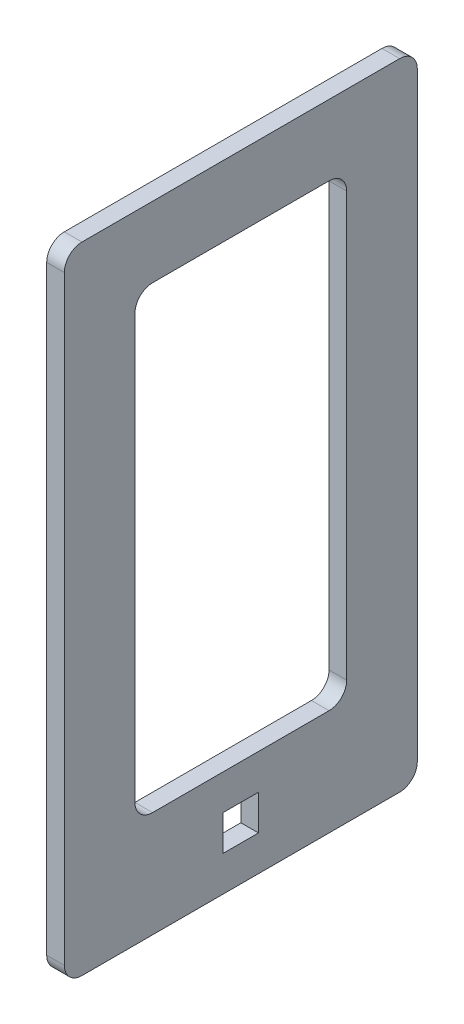
ISO-10303-21;
HEADER;
FILE_DESCRIPTION(('STEP AP214'),'2;1');
FILE_NAME('part.step','',(''),(''),'','','');
FILE_SCHEMA(('AUTOMOTIVE_DESIGN { 1 0 10303 214 1 1 1 1 }'));
ENDSEC;
DATA;
#1=APPLICATION_CONTEXT('core data for automotive mechanical design processes');
#2=APPLICATION_PROTOCOL_DEFINITION('international standard','automotive_design',2000,#1);
#3=PRODUCT_CONTEXT('',#1,'mechanical');
#4=PRODUCT('Part','Part','',(#3));
#5=PRODUCT_RELATED_PRODUCT_CATEGORY('part','',(#4));
#6=PRODUCT_DEFINITION_FORMATION('','',#4);
#7=PRODUCT_DEFINITION_CONTEXT('part definition',#1,'design');
#8=PRODUCT_DEFINITION('design','',#6,#7);
#9=PRODUCT_DEFINITION_SHAPE('','',#8);
#10=(LENGTH_UNIT() NAMED_UNIT(*) SI_UNIT(.MILLI.,.METRE.));
#11=(NAMED_UNIT(*) PLANE_ANGLE_UNIT() SI_UNIT($,.RADIAN.));
#12=(NAMED_UNIT(*) SI_UNIT($,.STERADIAN.) SOLID_ANGLE_UNIT());
#13=UNCERTAINTY_MEASURE_WITH_UNIT(LENGTH_MEASURE(1.E-05),#10,'distance_accuracy_value','');
#14=(GEOMETRIC_REPRESENTATION_CONTEXT(3) GLOBAL_UNCERTAINTY_ASSIGNED_CONTEXT((#13)) GLOBAL_UNIT_ASSIGNED_CONTEXT((#10,
#11,#12)) REPRESENTATION_CONTEXT('',''));
#15=CARTESIAN_POINT('',(0.,0.,0.));
#16=DIRECTION('',(0.,0.,1.));
#17=DIRECTION('',(1.,0.,0.));
#18=AXIS2_PLACEMENT_3D('',#15,#16,#17);
#19=CARTESIAN_POINT('',(6.35,-107.95,57.15));
#20=DIRECTION('',(-1.,0.,0.));
#21=DIRECTION('',(0.,0.,1.));
#22=AXIS2_PLACEMENT_3D('',#19,#20,#21);
#23=PLANE('',#22);
#24=DIRECTION('',(0.,0.,1.));
#25=VECTOR('',#24,1.);
#26=CARTESIAN_POINT('',(6.35,-88.9,6.35000000000005));
#27=LINE('',#26,#25);
#28=CARTESIAN_POINT('',(6.35,-88.9,-6.34999999999995));
#29=VERTEX_POINT('',#28);
#30=CARTESIAN_POINT('',(6.35,-88.9,6.35000000000005));
#31=VERTEX_POINT('',#30);
#32=EDGE_CURVE('E201',#29,#31,#27,.T.);
#33=ORIENTED_EDGE('',*,*,#32,.F.);
#34=DIRECTION('',(0.,1.,0.));
#35=VECTOR('',#34,1.);
#36=CARTESIAN_POINT('',(6.35,-101.6,-6.34999999999995));
#37=LINE('',#36,#35);
#38=CARTESIAN_POINT('',(6.35,-101.6,-6.34999999999995));
#39=VERTEX_POINT('',#38);
#40=EDGE_CURVE('E55',#39,#29,#37,.T.);
#41=ORIENTED_EDGE('',*,*,#40,.F.);
#42=DIRECTION('',(0.,0.,-1.));
#43=VECTOR('',#42,1.);
#44=CARTESIAN_POINT('',(6.35,-101.6,6.35000000000005));
#45=LINE('',#44,#43);
#46=CARTESIAN_POINT('',(6.35,-101.6,6.35000000000005));
#47=VERTEX_POINT('',#46);
#48=EDGE_CURVE('E191',#47,#39,#45,.T.);
#49=ORIENTED_EDGE('',*,*,#48,.F.);
#50=DIRECTION('',(0.,-1.,0.));
#51=VECTOR('',#50,1.);
#52=CARTESIAN_POINT('',(6.35,-101.6,6.35000000000005));
#53=LINE('',#52,#51);
#54=EDGE_CURVE('E209',#31,#47,#53,.T.);
#55=ORIENTED_EDGE('',*,*,#54,.F.);
#56=EDGE_LOOP('',(#33,#41,#49,#55));
#57=FACE_BOUND('',#56,.T.);
#58=CARTESIAN_POINT('',(6.35,-107.95,57.15));
#59=DIRECTION('',(1.,0.,0.));
#60=DIRECTION('',(0.,0.,1.));
#61=AXIS2_PLACEMENT_3D('',#58,#59,#60);
#62=CIRCLE('',#61,6.35);
#63=CARTESIAN_POINT('',(6.35,-107.95,63.5));
#64=VERTEX_POINT('',#63);
#65=CARTESIAN_POINT('',(6.35,-114.3,57.15));
#66=VERTEX_POINT('',#65);
#67=EDGE_CURVE('E306',#64,#66,#62,.T.);
#68=ORIENTED_EDGE('',*,*,#67,.T.);
#69=DIRECTION('',(0.,0.,-1.));
#70=VECTOR('',#69,1.);
#71=CARTESIAN_POINT('',(6.35,-114.3,57.15));
#72=LINE('',#71,#70);
#73=CARTESIAN_POINT('',(6.35,-114.3,-57.15));
#74=VERTEX_POINT('',#73);
#75=EDGE_CURVE('E310',#66,#74,#72,.T.);
#76=ORIENTED_EDGE('',*,*,#75,.T.);
#77=CARTESIAN_POINT('',(6.35,-107.95,-57.15));
#78=DIRECTION('',(1.,0.,0.));
#79=DIRECTION('',(0.,0.,1.));
#80=AXIS2_PLACEMENT_3D('',#77,#78,#79);
#81=CIRCLE('',#80,6.35);
#82=CARTESIAN_POINT('',(6.35,-107.95,-63.5));
#83=VERTEX_POINT('',#82);
#84=EDGE_CURVE('E314',#74,#83,#81,.T.);
#85=ORIENTED_EDGE('',*,*,#84,.T.);
#86=DIRECTION('',(0.,1.,0.));
#87=VECTOR('',#86,1.);
#88=CARTESIAN_POINT('',(6.35,-107.95,-63.5));
#89=LINE('',#88,#87);
#90=CARTESIAN_POINT('',(6.35,107.95,-63.5));
#91=VERTEX_POINT('',#90);
#92=EDGE_CURVE('E317',#83,#91,#89,.T.);
#93=ORIENTED_EDGE('',*,*,#92,.T.);
#94=CARTESIAN_POINT('',(6.35,107.95,-57.15));
#95=DIRECTION('',(1.,0.,0.));
#96=DIRECTION('',(0.,0.,-1.));
#97=AXIS2_PLACEMENT_3D('',#94,#95,#96);
#98=CIRCLE('',#97,6.35);
#99=CARTESIAN_POINT('',(6.35,114.3,-57.15));
#100=VERTEX_POINT('',#99);
#101=EDGE_CURVE('E320',#91,#100,#98,.T.);
#102=ORIENTED_EDGE('',*,*,#101,.T.);
#103=DIRECTION('',(0.,0.,1.));
#104=VECTOR('',#103,1.);
#105=CARTESIAN_POINT('',(6.35,114.3,57.15));
#106=LINE('',#105,#104);
#107=CARTESIAN_POINT('',(6.35,114.3,57.15));
#108=VERTEX_POINT('',#107);
#109=EDGE_CURVE('E323',#100,#108,#106,.T.);
#110=ORIENTED_EDGE('',*,*,#109,.T.);
#111=CARTESIAN_POINT('',(6.35,107.95,57.15));
#112=DIRECTION('',(1.,0.,0.));
#113=DIRECTION('',(0.,0.,1.));
#114=AXIS2_PLACEMENT_3D('',#111,#112,#113);
#115=CIRCLE('',#114,6.35);
#116=CARTESIAN_POINT('',(6.35,107.95,63.5));
#117=VERTEX_POINT('',#116);
#118=EDGE_CURVE('E326',#108,#117,#115,.T.);
#119=ORIENTED_EDGE('',*,*,#118,.T.);
#120=DIRECTION('',(0.,-1.,0.));
#121=VECTOR('',#120,1.);
#122=CARTESIAN_POINT('',(6.35,-107.95,63.5));
#123=LINE('',#122,#121);
#124=EDGE_CURVE('E329',#117,#64,#123,.T.);
#125=ORIENTED_EDGE('',*,*,#124,.T.);
#126=EDGE_LOOP('',(#68,#76,#85,#93,#102,#110,#119,#125));
#127=FACE_BOUND('',#126,.T.);
#128=CARTESIAN_POINT('',(6.35,-69.85,-31.75));
#129=DIRECTION('',(1.,0.,0.));
#130=DIRECTION('',(0.,0.,-1.));
#131=AXIS2_PLACEMENT_3D('',#128,#129,#130);
#132=CIRCLE('',#131,6.34999999999999);
#133=CARTESIAN_POINT('',(6.35,-76.2,-31.75));
#134=VERTEX_POINT('',#133);
#135=CARTESIAN_POINT('',(6.35,-69.85,-38.1));
#136=VERTEX_POINT('',#135);
#137=EDGE_CURVE('E223',#134,#136,#132,.T.);
#138=ORIENTED_EDGE('',*,*,#137,.F.);
#139=DIRECTION('',(0.,0.,-1.));
#140=VECTOR('',#139,1.);
#141=CARTESIAN_POINT('',(6.35,-76.2,31.75));
#142=LINE('',#141,#140);
#143=CARTESIAN_POINT('',(6.35,-76.2,31.75));
#144=VERTEX_POINT('',#143);
#145=EDGE_CURVE('E246',#144,#134,#142,.T.);
#146=ORIENTED_EDGE('',*,*,#145,.F.);
#147=CARTESIAN_POINT('',(6.35,-69.85,31.75));
#148=DIRECTION('',(1.,0.,0.));
#149=DIRECTION('',(0.,0.,1.));
#150=AXIS2_PLACEMENT_3D('',#147,#148,#149);
#151=CIRCLE('',#150,6.35);
#152=CARTESIAN_POINT('',(6.35,-69.85,38.1));
#153=VERTEX_POINT('',#152);
#154=EDGE_CURVE('E242',#153,#144,#151,.T.);
#155=ORIENTED_EDGE('',*,*,#154,.F.);
#156=DIRECTION('',(0.,-1.,0.));
#157=VECTOR('',#156,1.);
#158=CARTESIAN_POINT('',(6.35,-69.85,38.1));
#159=LINE('',#158,#157);
#160=CARTESIAN_POINT('',(6.35,82.55,38.1));
#161=VERTEX_POINT('',#160);
#162=EDGE_CURVE('E239',#161,#153,#159,.T.);
#163=ORIENTED_EDGE('',*,*,#162,.F.);
#164=CARTESIAN_POINT('',(6.35,82.55,31.75));
#165=DIRECTION('',(1.,0.,0.));
#166=DIRECTION('',(0.,0.,1.));
#167=AXIS2_PLACEMENT_3D('',#164,#165,#166);
#168=CIRCLE('',#167,6.35);
#169=CARTESIAN_POINT('',(6.35,88.9,31.75));
#170=VERTEX_POINT('',#169);
#171=EDGE_CURVE('E236',#170,#161,#168,.T.);
#172=ORIENTED_EDGE('',*,*,#171,.F.);
#173=DIRECTION('',(0.,0.,1.));
#174=VECTOR('',#173,1.);
#175=CARTESIAN_POINT('',(6.35,88.9,31.75));
#176=LINE('',#175,#174);
#177=CARTESIAN_POINT('',(6.35,88.9,-31.75));
#178=VERTEX_POINT('',#177);
#179=EDGE_CURVE('E233',#178,#170,#176,.T.);
#180=ORIENTED_EDGE('',*,*,#179,.F.);
#181=CARTESIAN_POINT('',(6.35,82.55,-31.75));
#182=DIRECTION('',(1.,0.,0.));
#183=DIRECTION('',(0.,0.,1.));
#184=AXIS2_PLACEMENT_3D('',#181,#182,#183);
#185=CIRCLE('',#184,6.35000000000001);
#186=CARTESIAN_POINT('',(6.35,82.55,-38.1));
#187=VERTEX_POINT('',#186);
#188=EDGE_CURVE('E230',#187,#178,#185,.T.);
#189=ORIENTED_EDGE('',*,*,#188,.F.);
#190=DIRECTION('',(0.,1.,0.));
#191=VECTOR('',#190,1.);
#192=CARTESIAN_POINT('',(6.35,-69.85,-38.1));
#193=LINE('',#192,#191);
#194=EDGE_CURVE('E226',#136,#187,#193,.T.);
#195=ORIENTED_EDGE('',*,*,#194,.F.);
#196=EDGE_LOOP('',(#138,#146,#155,#163,#172,#180,#189,#195));
#197=FACE_BOUND('',#196,.T.);
#198=ADVANCED_FACE('F39',(#57,#127,#197),#23,.F.);
#199=CARTESIAN_POINT('',(0.,-107.95,57.15));
#200=DIRECTION('',(-1.,0.,0.));
#201=DIRECTION('',(0.,0.,1.));
#202=AXIS2_PLACEMENT_3D('',#199,#200,#201);
#203=PLANE('',#202);
#204=DIRECTION('',(0.,1.,0.));
#205=VECTOR('',#204,1.);
#206=CARTESIAN_POINT('',(0.,-101.6,-6.34999999999995));
#207=LINE('',#206,#205);
#208=CARTESIAN_POINT('',(0.,-101.6,-6.34999999999995));
#209=VERTEX_POINT('',#208);
#210=CARTESIAN_POINT('',(0.,-88.9,-6.34999999999995));
#211=VERTEX_POINT('',#210);
#212=EDGE_CURVE('E188',#209,#211,#207,.T.);
#213=ORIENTED_EDGE('',*,*,#212,.T.);
#214=DIRECTION('',(0.,0.,1.));
#215=VECTOR('',#214,1.);
#216=CARTESIAN_POINT('',(0.,-88.9,6.35000000000005));
#217=LINE('',#216,#215);
#218=CARTESIAN_POINT('',(0.,-88.9,6.35000000000004));
#219=VERTEX_POINT('',#218);
#220=EDGE_CURVE('E176',#211,#219,#217,.T.);
#221=ORIENTED_EDGE('',*,*,#220,.T.);
#222=DIRECTION('',(0.,-1.,0.));
#223=VECTOR('',#222,1.);
#224=CARTESIAN_POINT('',(0.,-101.6,6.35000000000005));
#225=LINE('',#224,#223);
#226=CARTESIAN_POINT('',(0.,-101.6,6.35000000000005));
#227=VERTEX_POINT('',#226);
#228=EDGE_CURVE('E203',#219,#227,#225,.T.);
#229=ORIENTED_EDGE('',*,*,#228,.T.);
#230=DIRECTION('',(0.,0.,-1.));
#231=VECTOR('',#230,1.);
#232=CARTESIAN_POINT('',(0.,-101.6,6.35000000000005));
#233=LINE('',#232,#231);
#234=EDGE_CURVE('E196',#227,#209,#233,.T.);
#235=ORIENTED_EDGE('',*,*,#234,.T.);
#236=EDGE_LOOP('',(#213,#221,#229,#235));
#237=FACE_BOUND('',#236,.T.);
#238=CARTESIAN_POINT('',(0.,-107.95,57.15));
#239=DIRECTION('',(1.,0.,0.));
#240=DIRECTION('',(0.,0.,1.));
#241=AXIS2_PLACEMENT_3D('',#238,#239,#240);
#242=CIRCLE('',#241,6.35);
#243=CARTESIAN_POINT('',(0.,-107.95,63.5));
#244=VERTEX_POINT('',#243);
#245=CARTESIAN_POINT('',(0.,-114.3,57.15));
#246=VERTEX_POINT('',#245);
#247=EDGE_CURVE('E305',#244,#246,#242,.T.);
#248=ORIENTED_EDGE('',*,*,#247,.F.);
#249=DIRECTION('',(0.,-1.,0.));
#250=VECTOR('',#249,1.);
#251=CARTESIAN_POINT('',(0.,-107.95,63.5));
#252=LINE('',#251,#250);
#253=CARTESIAN_POINT('',(0.,107.95,63.5));
#254=VERTEX_POINT('',#253);
#255=EDGE_CURVE('E311',#254,#244,#252,.T.);
#256=ORIENTED_EDGE('',*,*,#255,.F.);
#257=CARTESIAN_POINT('',(0.,107.95,57.15));
#258=DIRECTION('',(1.,0.,0.));
#259=DIRECTION('',(0.,0.,1.));
#260=AXIS2_PLACEMENT_3D('',#257,#258,#259);
#261=CIRCLE('',#260,6.35);
#262=CARTESIAN_POINT('',(0.,114.3,57.15));
#263=VERTEX_POINT('',#262);
#264=EDGE_CURVE('E351',#263,#254,#261,.T.);
#265=ORIENTED_EDGE('',*,*,#264,.F.);
#266=DIRECTION('',(0.,0.,1.));
#267=VECTOR('',#266,1.);
#268=CARTESIAN_POINT('',(0.,114.3,57.15));
#269=LINE('',#268,#267);
#270=CARTESIAN_POINT('',(0.,114.3,-57.15));
#271=VERTEX_POINT('',#270);
#272=EDGE_CURVE('E348',#271,#263,#269,.T.);
#273=ORIENTED_EDGE('',*,*,#272,.F.);
#274=CARTESIAN_POINT('',(0.,107.95,-57.15));
#275=DIRECTION('',(1.,0.,0.));
#276=DIRECTION('',(0.,0.,-1.));
#277=AXIS2_PLACEMENT_3D('',#274,#275,#276);
#278=CIRCLE('',#277,6.35);
#279=CARTESIAN_POINT('',(0.,107.95,-63.5));
#280=VERTEX_POINT('',#279);
#281=EDGE_CURVE('E345',#280,#271,#278,.T.);
#282=ORIENTED_EDGE('',*,*,#281,.F.);
#283=DIRECTION('',(0.,1.,0.));
#284=VECTOR('',#283,1.);
#285=CARTESIAN_POINT('',(0.,-107.95,-63.5));
#286=LINE('',#285,#284);
#287=CARTESIAN_POINT('',(0.,-107.95,-63.5));
#288=VERTEX_POINT('',#287);
#289=EDGE_CURVE('E342',#288,#280,#286,.T.);
#290=ORIENTED_EDGE('',*,*,#289,.F.);
#291=CARTESIAN_POINT('',(0.,-107.95,-57.15));
#292=DIRECTION('',(1.,0.,0.));
#293=DIRECTION('',(0.,0.,1.));
#294=AXIS2_PLACEMENT_3D('',#291,#292,#293);
#295=CIRCLE('',#294,6.35);
#296=CARTESIAN_POINT('',(0.,-114.3,-57.15));
#297=VERTEX_POINT('',#296);
#298=EDGE_CURVE('E339',#297,#288,#295,.T.);
#299=ORIENTED_EDGE('',*,*,#298,.F.);
#300=DIRECTION('',(0.,0.,-1.));
#301=VECTOR('',#300,1.);
#302=CARTESIAN_POINT('',(0.,-114.3,57.15));
#303=LINE('',#302,#301);
#304=EDGE_CURVE('E336',#246,#297,#303,.T.);
#305=ORIENTED_EDGE('',*,*,#304,.F.);
#306=EDGE_LOOP('',(#248,#256,#265,#273,#282,#290,#299,#305));
#307=FACE_BOUND('',#306,.T.);
#308=DIRECTION('',(0.,0.,-1.));
#309=VECTOR('',#308,1.);
#310=CARTESIAN_POINT('',(0.,-76.2,31.75));
#311=LINE('',#310,#309);
#312=CARTESIAN_POINT('',(0.,-76.2,31.75));
#313=VERTEX_POINT('',#312);
#314=CARTESIAN_POINT('',(0.,-76.2,-31.75));
#315=VERTEX_POINT('',#314);
#316=EDGE_CURVE('E227',#313,#315,#311,.T.);
#317=ORIENTED_EDGE('',*,*,#316,.T.);
#318=CARTESIAN_POINT('',(0.,-69.85,-31.75));
#319=DIRECTION('',(1.,0.,0.));
#320=DIRECTION('',(0.,0.,-1.));
#321=AXIS2_PLACEMENT_3D('',#318,#319,#320);
#322=CIRCLE('',#321,6.34999999999999);
#323=CARTESIAN_POINT('',(0.,-69.85,-38.1));
#324=VERTEX_POINT('',#323);
#325=EDGE_CURVE('E184',#315,#324,#322,.T.);
#326=ORIENTED_EDGE('',*,*,#325,.T.);
#327=DIRECTION('',(0.,1.,0.));
#328=VECTOR('',#327,1.);
#329=CARTESIAN_POINT('',(0.,-69.85,-38.1));
#330=LINE('',#329,#328);
#331=CARTESIAN_POINT('',(0.,82.55,-38.1));
#332=VERTEX_POINT('',#331);
#333=EDGE_CURVE('E253',#324,#332,#330,.T.);
#334=ORIENTED_EDGE('',*,*,#333,.T.);
#335=CARTESIAN_POINT('',(0.,82.55,-31.75));
#336=DIRECTION('',(1.,0.,0.));
#337=DIRECTION('',(0.,0.,1.));
#338=AXIS2_PLACEMENT_3D('',#335,#336,#337);
#339=CIRCLE('',#338,6.35000000000001);
#340=CARTESIAN_POINT('',(0.,88.9,-31.75));
#341=VERTEX_POINT('',#340);
#342=EDGE_CURVE('E257',#332,#341,#339,.T.);
#343=ORIENTED_EDGE('',*,*,#342,.T.);
#344=DIRECTION('',(0.,0.,1.));
#345=VECTOR('',#344,1.);
#346=CARTESIAN_POINT('',(0.,88.9,31.75));
#347=LINE('',#346,#345);
#348=CARTESIAN_POINT('',(0.,88.9,31.75));
#349=VERTEX_POINT('',#348);
#350=EDGE_CURVE('E261',#341,#349,#347,.T.);
#351=ORIENTED_EDGE('',*,*,#350,.T.);
#352=CARTESIAN_POINT('',(0.,82.55,31.75));
#353=DIRECTION('',(1.,0.,0.));
#354=DIRECTION('',(0.,0.,1.));
#355=AXIS2_PLACEMENT_3D('',#352,#353,#354);
#356=CIRCLE('',#355,6.35);
#357=CARTESIAN_POINT('',(0.,82.55,38.1));
#358=VERTEX_POINT('',#357);
#359=EDGE_CURVE('E265',#349,#358,#356,.T.);
#360=ORIENTED_EDGE('',*,*,#359,.T.);
#361=DIRECTION('',(0.,-1.,0.));
#362=VECTOR('',#361,1.);
#363=CARTESIAN_POINT('',(0.,-69.85,38.1));
#364=LINE('',#363,#362);
#365=CARTESIAN_POINT('',(0.,-69.85,38.1));
#366=VERTEX_POINT('',#365);
#367=EDGE_CURVE('E269',#358,#366,#364,.T.);
#368=ORIENTED_EDGE('',*,*,#367,.T.);
#369=CARTESIAN_POINT('',(0.,-69.85,31.75));
#370=DIRECTION('',(1.,0.,0.));
#371=DIRECTION('',(0.,0.,1.));
#372=AXIS2_PLACEMENT_3D('',#369,#370,#371);
#373=CIRCLE('',#372,6.35);
#374=EDGE_CURVE('E273',#366,#313,#373,.T.);
#375=ORIENTED_EDGE('',*,*,#374,.T.);
#376=EDGE_LOOP('',(#317,#326,#334,#343,#351,#360,#368,#375));
#377=FACE_BOUND('',#376,.T.);
#378=ADVANCED_FACE('F194',(#237,#307,#377),#203,.T.);
#379=CARTESIAN_POINT('',(6.35,-107.95,57.15));
#380=DIRECTION('',(-1.,0.,0.));
#381=DIRECTION('',(0.,0.,1.));
#382=AXIS2_PLACEMENT_3D('',#379,#380,#381);
#383=CYLINDRICAL_SURFACE('',#382,6.35);
#384=ORIENTED_EDGE('',*,*,#247,.T.);
#385=DIRECTION('',(-1.,0.,0.));
#386=VECTOR('',#385,1.);
#387=CARTESIAN_POINT('',(6.35,-114.3,57.15));
#388=LINE('',#387,#386);
#389=EDGE_CURVE('E11',#66,#246,#388,.T.);
#390=ORIENTED_EDGE('',*,*,#389,.F.);
#391=ORIENTED_EDGE('',*,*,#67,.F.);
#392=DIRECTION('',(-1.,0.,0.));
#393=VECTOR('',#392,1.);
#394=CARTESIAN_POINT('',(6.35,-107.95,63.5));
#395=LINE('',#394,#393);
#396=EDGE_CURVE('E332',#64,#244,#395,.T.);
#397=ORIENTED_EDGE('',*,*,#396,.T.);
#398=EDGE_LOOP('',(#384,#390,#391,#397));
#399=FACE_BOUND('',#398,.T.);
#400=ADVANCED_FACE('F41',(#399),#383,.T.);
#401=CARTESIAN_POINT('',(6.35,-114.3,57.15));
#402=DIRECTION('',(0.,1.,0.));
#403=DIRECTION('',(0.,0.,1.));
#404=AXIS2_PLACEMENT_3D('',#401,#402,#403);
#405=PLANE('',#404);
#406=ORIENTED_EDGE('',*,*,#304,.T.);
#407=DIRECTION('',(-1.,0.,0.));
#408=VECTOR('',#407,1.);
#409=CARTESIAN_POINT('',(6.35,-114.3,-57.15));
#410=LINE('',#409,#408);
#411=EDGE_CURVE('E48',#74,#297,#410,.T.);
#412=ORIENTED_EDGE('',*,*,#411,.F.);
#413=ORIENTED_EDGE('',*,*,#75,.F.);
#414=ORIENTED_EDGE('',*,*,#389,.T.);
#415=EDGE_LOOP('',(#406,#412,#413,#414));
#416=FACE_BOUND('',#415,.T.);
#417=ADVANCED_FACE('F406',(#416),#405,.F.);
#418=CARTESIAN_POINT('',(6.35,-107.95,-57.15));
#419=DIRECTION('',(-1.,0.,0.));
#420=DIRECTION('',(0.,0.,1.));
#421=AXIS2_PLACEMENT_3D('',#418,#419,#420);
#422=CYLINDRICAL_SURFACE('',#421,6.35);
#423=ORIENTED_EDGE('',*,*,#298,.T.);
#424=DIRECTION('',(-1.,0.,0.));
#425=VECTOR('',#424,1.);
#426=CARTESIAN_POINT('',(6.35,-107.95,-63.5));
#427=LINE('',#426,#425);
#428=EDGE_CURVE('E375',#83,#288,#427,.T.);
#429=ORIENTED_EDGE('',*,*,#428,.F.);
#430=ORIENTED_EDGE('',*,*,#84,.F.);
#431=ORIENTED_EDGE('',*,*,#411,.T.);
#432=EDGE_LOOP('',(#423,#429,#430,#431));
#433=FACE_BOUND('',#432,.T.);
#434=ADVANCED_FACE('F384',(#433),#422,.T.);
#435=CARTESIAN_POINT('',(6.35,-107.95,-63.5));
#436=DIRECTION('',(0.,0.,1.));
#437=DIRECTION('',(1.,0.,0.));
#438=AXIS2_PLACEMENT_3D('',#435,#436,#437);
#439=PLANE('',#438);
#440=ORIENTED_EDGE('',*,*,#289,.T.);
#441=DIRECTION('',(-1.,0.,0.));
#442=VECTOR('',#441,1.);
#443=CARTESIAN_POINT('',(6.35,107.95,-63.5));
#444=LINE('',#443,#442);
#445=EDGE_CURVE('E371',#91,#280,#444,.T.);
#446=ORIENTED_EDGE('',*,*,#445,.F.);
#447=ORIENTED_EDGE('',*,*,#92,.F.);
#448=ORIENTED_EDGE('',*,*,#428,.T.);
#449=EDGE_LOOP('',(#440,#446,#447,#448));
#450=FACE_BOUND('',#449,.T.);
#451=ADVANCED_FACE('F394',(#450),#439,.F.);
#452=CARTESIAN_POINT('',(6.35,107.95,-57.15));
#453=DIRECTION('',(-1.,0.,0.));
#454=DIRECTION('',(0.,0.,1.));
#455=AXIS2_PLACEMENT_3D('',#452,#453,#454);
#456=CYLINDRICAL_SURFACE('',#455,6.35);
#457=ORIENTED_EDGE('',*,*,#281,.T.);
#458=DIRECTION('',(-1.,0.,0.));
#459=VECTOR('',#458,1.);
#460=CARTESIAN_POINT('',(6.35,114.3,-57.15));
#461=LINE('',#460,#459);
#462=EDGE_CURVE('E367',#100,#271,#461,.T.);
#463=ORIENTED_EDGE('',*,*,#462,.F.);
#464=ORIENTED_EDGE('',*,*,#101,.F.);
#465=ORIENTED_EDGE('',*,*,#445,.T.);
#466=EDGE_LOOP('',(#457,#463,#464,#465));
#467=FACE_BOUND('',#466,.T.);
#468=ADVANCED_FACE('F398',(#467),#456,.T.);
#469=CARTESIAN_POINT('',(6.35,114.3,57.15));
#470=DIRECTION('',(0.,-1.,0.));
#471=DIRECTION('',(0.,0.,-1.));
#472=AXIS2_PLACEMENT_3D('',#469,#470,#471);
#473=PLANE('',#472);
#474=ORIENTED_EDGE('',*,*,#272,.T.);
#475=DIRECTION('',(-1.,0.,0.));
#476=VECTOR('',#475,1.);
#477=CARTESIAN_POINT('',(6.35,114.3,57.15));
#478=LINE('',#477,#476);
#479=EDGE_CURVE('E363',#108,#263,#478,.T.);
#480=ORIENTED_EDGE('',*,*,#479,.F.);
#481=ORIENTED_EDGE('',*,*,#109,.F.);
#482=ORIENTED_EDGE('',*,*,#462,.T.);
#483=EDGE_LOOP('',(#474,#480,#481,#482));
#484=FACE_BOUND('',#483,.T.);
#485=ADVANCED_FACE('F419',(#484),#473,.F.);
#486=CARTESIAN_POINT('',(6.35,107.95,57.15));
#487=DIRECTION('',(-1.,0.,0.));
#488=DIRECTION('',(0.,0.,1.));
#489=AXIS2_PLACEMENT_3D('',#486,#487,#488);
#490=CYLINDRICAL_SURFACE('',#489,6.35);
#491=ORIENTED_EDGE('',*,*,#264,.T.);
#492=DIRECTION('',(-1.,0.,0.));
#493=VECTOR('',#492,1.);
#494=CARTESIAN_POINT('',(6.35,107.95,63.5));
#495=LINE('',#494,#493);
#496=EDGE_CURVE('E359',#117,#254,#495,.T.);
#497=ORIENTED_EDGE('',*,*,#496,.F.);
#498=ORIENTED_EDGE('',*,*,#118,.F.);
#499=ORIENTED_EDGE('',*,*,#479,.T.);
#500=EDGE_LOOP('',(#491,#497,#498,#499));
#501=FACE_BOUND('',#500,.T.);
#502=ADVANCED_FACE('F417',(#501),#490,.T.);
#503=CARTESIAN_POINT('',(6.35,-107.95,63.5));
#504=DIRECTION('',(0.,0.,-1.));
#505=DIRECTION('',(-1.,0.,0.));
#506=AXIS2_PLACEMENT_3D('',#503,#504,#505);
#507=PLANE('',#506);
#508=ORIENTED_EDGE('',*,*,#255,.T.);
#509=ORIENTED_EDGE('',*,*,#396,.F.);
#510=ORIENTED_EDGE('',*,*,#124,.F.);
#511=ORIENTED_EDGE('',*,*,#496,.T.);
#512=EDGE_LOOP('',(#508,#509,#510,#511));
#513=FACE_BOUND('',#512,.T.);
#514=ADVANCED_FACE('F412',(#513),#507,.F.);
#515=CARTESIAN_POINT('',(6.35,-69.85,-31.75));
#516=DIRECTION('',(-1.,0.,0.));
#517=DIRECTION('',(0.,0.,1.));
#518=AXIS2_PLACEMENT_3D('',#515,#516,#517);
#519=CYLINDRICAL_SURFACE('',#518,6.34999999999999);
#520=ORIENTED_EDGE('',*,*,#325,.F.);
#521=DIRECTION('',(-1.,0.,0.));
#522=VECTOR('',#521,1.);
#523=CARTESIAN_POINT('',(6.35,-76.2,-31.75));
#524=LINE('',#523,#522);
#525=EDGE_CURVE('E249',#134,#315,#524,.T.);
#526=ORIENTED_EDGE('',*,*,#525,.F.);
#527=ORIENTED_EDGE('',*,*,#137,.T.);
#528=DIRECTION('',(-1.,0.,0.));
#529=VECTOR('',#528,1.);
#530=CARTESIAN_POINT('',(6.35,-69.85,-38.1));
#531=LINE('',#530,#529);
#532=EDGE_CURVE('E301',#136,#324,#531,.T.);
#533=ORIENTED_EDGE('',*,*,#532,.T.);
#534=EDGE_LOOP('',(#520,#526,#527,#533));
#535=FACE_BOUND('',#534,.T.);
#536=ADVANCED_FACE('F436',(#535),#519,.F.);
#537=CARTESIAN_POINT('',(6.35,-69.85,-38.1));
#538=DIRECTION('',(0.,0.,1.));
#539=DIRECTION('',(0.,-1.,0.));
#540=AXIS2_PLACEMENT_3D('',#537,#538,#539);
#541=PLANE('',#540);
#542=ORIENTED_EDGE('',*,*,#333,.F.);
#543=ORIENTED_EDGE('',*,*,#532,.F.);
#544=ORIENTED_EDGE('',*,*,#194,.T.);
#545=DIRECTION('',(-1.,0.,0.));
#546=VECTOR('',#545,1.);
#547=CARTESIAN_POINT('',(6.35,82.55,-38.1));
#548=LINE('',#547,#546);
#549=EDGE_CURVE('E298',#187,#332,#548,.T.);
#550=ORIENTED_EDGE('',*,*,#549,.T.);
#551=EDGE_LOOP('',(#542,#543,#544,#550));
#552=FACE_BOUND('',#551,.T.);
#553=ADVANCED_FACE('F443',(#552),#541,.T.);
#554=CARTESIAN_POINT('',(6.35,82.55,-31.75));
#555=DIRECTION('',(-1.,0.,0.));
#556=DIRECTION('',(0.,0.,1.));
#557=AXIS2_PLACEMENT_3D('',#554,#555,#556);
#558=CYLINDRICAL_SURFACE('',#557,6.35000000000001);
#559=ORIENTED_EDGE('',*,*,#342,.F.);
#560=ORIENTED_EDGE('',*,*,#549,.F.);
#561=ORIENTED_EDGE('',*,*,#188,.T.);
#562=DIRECTION('',(-1.,0.,0.));
#563=VECTOR('',#562,1.);
#564=CARTESIAN_POINT('',(6.35,88.9,-31.75));
#565=LINE('',#564,#563);
#566=EDGE_CURVE('E295',#178,#341,#565,.T.);
#567=ORIENTED_EDGE('',*,*,#566,.T.);
#568=EDGE_LOOP('',(#559,#560,#561,#567));
#569=FACE_BOUND('',#568,.T.);
#570=ADVANCED_FACE('F448',(#569),#558,.F.);
#571=CARTESIAN_POINT('',(6.35,88.9,31.75));
#572=DIRECTION('',(0.,-1.,0.));
#573=DIRECTION('',(0.,0.,-1.));
#574=AXIS2_PLACEMENT_3D('',#571,#572,#573);
#575=PLANE('',#574);
#576=ORIENTED_EDGE('',*,*,#350,.F.);
#577=ORIENTED_EDGE('',*,*,#566,.F.);
#578=ORIENTED_EDGE('',*,*,#179,.T.);
#579=DIRECTION('',(-1.,0.,0.));
#580=VECTOR('',#579,1.);
#581=CARTESIAN_POINT('',(6.35,88.9,31.75));
#582=LINE('',#581,#580);
#583=EDGE_CURVE('E292',#170,#349,#582,.T.);
#584=ORIENTED_EDGE('',*,*,#583,.T.);
#585=EDGE_LOOP('',(#576,#577,#578,#584));
#586=FACE_BOUND('',#585,.T.);
#587=ADVANCED_FACE('F473',(#586),#575,.T.);
#588=CARTESIAN_POINT('',(6.35,82.55,31.75));
#589=DIRECTION('',(-1.,0.,0.));
#590=DIRECTION('',(0.,0.,1.));
#591=AXIS2_PLACEMENT_3D('',#588,#589,#590);
#592=CYLINDRICAL_SURFACE('',#591,6.35);
#593=ORIENTED_EDGE('',*,*,#359,.F.);
#594=ORIENTED_EDGE('',*,*,#583,.F.);
#595=ORIENTED_EDGE('',*,*,#171,.T.);
#596=DIRECTION('',(-1.,0.,0.));
#597=VECTOR('',#596,1.);
#598=CARTESIAN_POINT('',(6.35,82.55,38.1));
#599=LINE('',#598,#597);
#600=EDGE_CURVE('E289',#161,#358,#599,.T.);
#601=ORIENTED_EDGE('',*,*,#600,.T.);
#602=EDGE_LOOP('',(#593,#594,#595,#601));
#603=FACE_BOUND('',#602,.T.);
#604=ADVANCED_FACE('F478',(#603),#592,.F.);
#605=CARTESIAN_POINT('',(6.35,-69.85,38.1));
#606=DIRECTION('',(0.,0.,-1.));
#607=DIRECTION('',(-1.,0.,0.));
#608=AXIS2_PLACEMENT_3D('',#605,#606,#607);
#609=PLANE('',#608);
#610=ORIENTED_EDGE('',*,*,#367,.F.);
#611=ORIENTED_EDGE('',*,*,#600,.F.);
#612=ORIENTED_EDGE('',*,*,#162,.T.);
#613=DIRECTION('',(-1.,0.,0.));
#614=VECTOR('',#613,1.);
#615=CARTESIAN_POINT('',(6.35,-69.85,38.1));
#616=LINE('',#615,#614);
#617=EDGE_CURVE('E286',#153,#366,#616,.T.);
#618=ORIENTED_EDGE('',*,*,#617,.T.);
#619=EDGE_LOOP('',(#610,#611,#612,#618));
#620=FACE_BOUND('',#619,.T.);
#621=ADVANCED_FACE('F481',(#620),#609,.T.);
#622=CARTESIAN_POINT('',(6.35,-69.85,31.75));
#623=DIRECTION('',(-1.,0.,0.));
#624=DIRECTION('',(0.,0.,1.));
#625=AXIS2_PLACEMENT_3D('',#622,#623,#624);
#626=CYLINDRICAL_SURFACE('',#625,6.35);
#627=ORIENTED_EDGE('',*,*,#374,.F.);
#628=ORIENTED_EDGE('',*,*,#617,.F.);
#629=ORIENTED_EDGE('',*,*,#154,.T.);
#630=DIRECTION('',(-1.,0.,0.));
#631=VECTOR('',#630,1.);
#632=CARTESIAN_POINT('',(6.35,-76.2,31.75));
#633=LINE('',#632,#631);
#634=EDGE_CURVE('E283',#144,#313,#633,.T.);
#635=ORIENTED_EDGE('',*,*,#634,.T.);
#636=EDGE_LOOP('',(#627,#628,#629,#635));
#637=FACE_BOUND('',#636,.T.);
#638=ADVANCED_FACE('F461',(#637),#626,.F.);
#639=CARTESIAN_POINT('',(6.35,-76.2,31.75));
#640=DIRECTION('',(0.,1.,0.));
#641=DIRECTION('',(0.,0.,1.));
#642=AXIS2_PLACEMENT_3D('',#639,#640,#641);
#643=PLANE('',#642);
#644=ORIENTED_EDGE('',*,*,#316,.F.);
#645=ORIENTED_EDGE('',*,*,#634,.F.);
#646=ORIENTED_EDGE('',*,*,#145,.T.);
#647=ORIENTED_EDGE('',*,*,#525,.T.);
#648=EDGE_LOOP('',(#644,#645,#646,#647));
#649=FACE_BOUND('',#648,.T.);
#650=ADVANCED_FACE('F455',(#649),#643,.T.);
#651=CARTESIAN_POINT('',(-0.00100000000000013,-101.6,-6.34999999999995));
#652=DIRECTION('',(0.,0.,-1.));
#653=DIRECTION('',(-1.,0.,0.));
#654=AXIS2_PLACEMENT_3D('',#651,#652,#653);
#655=PLANE('',#654);
#656=DIRECTION('',(1.,0.,0.));
#657=VECTOR('',#656,1.);
#658=CARTESIAN_POINT('',(-0.00100000000000013,-101.6,-6.34999999999995));
#659=LINE('',#658,#657);
#660=EDGE_CURVE('E185',#209,#39,#659,.T.);
#661=ORIENTED_EDGE('',*,*,#660,.T.);
#662=ORIENTED_EDGE('',*,*,#40,.T.);
#663=DIRECTION('',(1.,0.,0.));
#664=VECTOR('',#663,1.);
#665=CARTESIAN_POINT('',(-0.00100000000000013,-88.9,-6.34999999999995));
#666=LINE('',#665,#664);
#667=EDGE_CURVE('E178',#211,#29,#666,.T.);
#668=ORIENTED_EDGE('',*,*,#667,.F.);
#669=ORIENTED_EDGE('',*,*,#212,.F.);
#670=EDGE_LOOP('',(#661,#662,#668,#669));
#671=FACE_BOUND('',#670,.T.);
#672=ADVANCED_FACE('F187',(#671),#655,.F.);
#673=CARTESIAN_POINT('',(-0.00100000000000013,-101.6,6.35000000000005));
#674=DIRECTION('',(0.,-1.,0.));
#675=DIRECTION('',(0.,0.,-1.));
#676=AXIS2_PLACEMENT_3D('',#673,#674,#675);
#677=PLANE('',#676);
#678=DIRECTION('',(1.,0.,0.));
#679=VECTOR('',#678,1.);
#680=CARTESIAN_POINT('',(-0.00100000000000013,-101.6,6.35000000000005));
#681=LINE('',#680,#679);
#682=EDGE_CURVE('E218',#227,#47,#681,.T.);
#683=ORIENTED_EDGE('',*,*,#682,.T.);
#684=ORIENTED_EDGE('',*,*,#48,.T.);
#685=ORIENTED_EDGE('',*,*,#660,.F.);
#686=ORIENTED_EDGE('',*,*,#234,.F.);
#687=EDGE_LOOP('',(#683,#684,#685,#686));
#688=FACE_BOUND('',#687,.T.);
#689=ADVANCED_FACE('F545',(#688),#677,.F.);
#690=CARTESIAN_POINT('',(-0.00100000000000013,-101.6,6.35000000000005));
#691=DIRECTION('',(0.,0.,1.));
#692=DIRECTION('',(1.,0.,0.));
#693=AXIS2_PLACEMENT_3D('',#690,#691,#692);
#694=PLANE('',#693);
#695=DIRECTION('',(1.,0.,0.));
#696=VECTOR('',#695,1.);
#697=CARTESIAN_POINT('',(-0.00100000000000013,-88.9,6.35000000000005));
#698=LINE('',#697,#696);
#699=EDGE_CURVE('E63',#219,#31,#698,.T.);
#700=ORIENTED_EDGE('',*,*,#699,.T.);
#701=ORIENTED_EDGE('',*,*,#54,.T.);
#702=ORIENTED_EDGE('',*,*,#682,.F.);
#703=ORIENTED_EDGE('',*,*,#228,.F.);
#704=EDGE_LOOP('',(#700,#701,#702,#703));
#705=FACE_BOUND('',#704,.T.);
#706=ADVANCED_FACE('F554',(#705),#694,.F.);
#707=CARTESIAN_POINT('',(-0.00100000000000013,-88.9,6.35000000000005));
#708=DIRECTION('',(0.,1.,0.));
#709=DIRECTION('',(0.,0.,1.));
#710=AXIS2_PLACEMENT_3D('',#707,#708,#709);
#711=PLANE('',#710);
#712=ORIENTED_EDGE('',*,*,#667,.T.);
#713=ORIENTED_EDGE('',*,*,#32,.T.);
#714=ORIENTED_EDGE('',*,*,#699,.F.);
#715=ORIENTED_EDGE('',*,*,#220,.F.);
#716=EDGE_LOOP('',(#712,#713,#714,#715));
#717=FACE_BOUND('',#716,.T.);
#718=ADVANCED_FACE('F177',(#717),#711,.F.);
#719=CLOSED_SHELL('',(#198,#378,#400,#417,#434,#451,#468,#485,#502,#514,#536,#553,#570,#587,
#604,#621,#638,#650,#672,#689,#706,#718));
#720=MANIFOLD_SOLID_BREP('B2',#719);
#721=ADVANCED_BREP_SHAPE_REPRESENTATION('',(#18,#720),#14);
#722=SHAPE_DEFINITION_REPRESENTATION(#9,#721);
ENDSEC;
END-ISO-10303-21;
